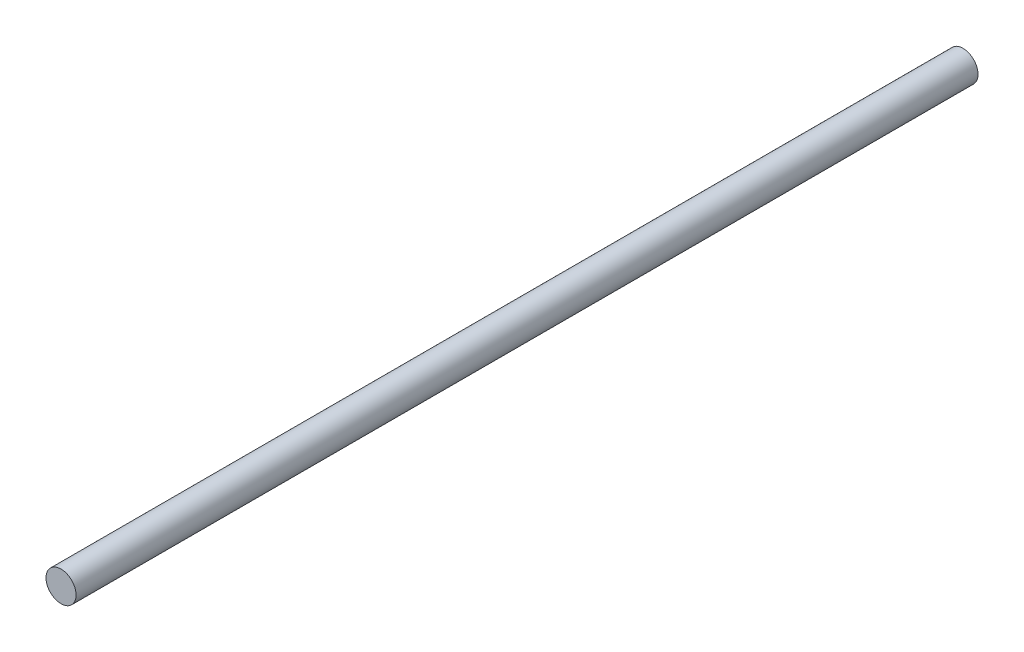
ISO-10303-21;
HEADER;
FILE_DESCRIPTION(('STEP AP214'),'2;1');
FILE_NAME('part.step','',(''),(''),'','','');
FILE_SCHEMA(('AUTOMOTIVE_DESIGN { 1 0 10303 214 1 1 1 1 }'));
ENDSEC;
DATA;
#1=APPLICATION_CONTEXT('core data for automotive mechanical design processes');
#2=APPLICATION_PROTOCOL_DEFINITION('international standard','automotive_design',2000,#1);
#3=PRODUCT_CONTEXT('',#1,'mechanical');
#4=PRODUCT('Part','Part','',(#3));
#5=PRODUCT_RELATED_PRODUCT_CATEGORY('part','',(#4));
#6=PRODUCT_DEFINITION_FORMATION('','',#4);
#7=PRODUCT_DEFINITION_CONTEXT('part definition',#1,'design');
#8=PRODUCT_DEFINITION('design','',#6,#7);
#9=PRODUCT_DEFINITION_SHAPE('','',#8);
#10=(LENGTH_UNIT() NAMED_UNIT(*) SI_UNIT(.MILLI.,.METRE.));
#11=(NAMED_UNIT(*) PLANE_ANGLE_UNIT() SI_UNIT($,.RADIAN.));
#12=(NAMED_UNIT(*) SI_UNIT($,.STERADIAN.) SOLID_ANGLE_UNIT());
#13=UNCERTAINTY_MEASURE_WITH_UNIT(LENGTH_MEASURE(1.E-05),#10,'distance_accuracy_value','');
#14=(GEOMETRIC_REPRESENTATION_CONTEXT(3) GLOBAL_UNCERTAINTY_ASSIGNED_CONTEXT((#13)) GLOBAL_UNIT_ASSIGNED_CONTEXT((#10,
#11,#12)) REPRESENTATION_CONTEXT('',''));
#15=CARTESIAN_POINT('',(0.,0.,0.));
#16=DIRECTION('',(0.,0.,1.));
#17=DIRECTION('',(1.,0.,0.));
#18=AXIS2_PLACEMENT_3D('',#15,#16,#17);
#19=CARTESIAN_POINT('',(0.,0.,45.));
#20=DIRECTION('',(0.,0.,-1.));
#21=DIRECTION('',(-1.,0.,0.));
#22=AXIS2_PLACEMENT_3D('',#19,#20,#21);
#23=CYLINDRICAL_SURFACE('',#22,1.);
#24=CARTESIAN_POINT('',(0.,0.,0.));
#25=DIRECTION('',(0.,0.,1.));
#26=DIRECTION('',(1.,0.,0.));
#27=AXIS2_PLACEMENT_3D('',#24,#25,#26);
#28=CIRCLE('',#27,1.);
#29=CARTESIAN_POINT('',(-1.,0.,0.));
#30=VERTEX_POINT('',#29);
#31=EDGE_CURVE('E10',#30,#30,#28,.T.);
#32=CARTESIAN_POINT('',(0.,0.,60.));
#33=DIRECTION('',(0.,0.,1.));
#34=DIRECTION('',(1.,0.,0.));
#35=AXIS2_PLACEMENT_3D('',#32,#33,#34);
#36=CIRCLE('',#35,1.);
#37=CARTESIAN_POINT('',(-1.,0.,60.));
#38=VERTEX_POINT('',#37);
#39=EDGE_CURVE('E39',#38,#38,#36,.T.);
#40=CARTESIAN_POINT('',(-1.,0.,0.));
#41=CARTESIAN_POINT('',(-1.,0.,0.624999999999994));
#42=CARTESIAN_POINT('',(-1.,0.,1.24999999999999));
#43=CARTESIAN_POINT('',(-1.,0.,2.5));
#44=CARTESIAN_POINT('',(-1.,0.,3.125));
#45=CARTESIAN_POINT('',(-1.,0.,4.375));
#46=CARTESIAN_POINT('',(-1.,0.,5.));
#47=CARTESIAN_POINT('',(-1.,0.,6.25));
#48=CARTESIAN_POINT('',(-1.,0.,6.87499999999999));
#49=CARTESIAN_POINT('',(-1.,0.,8.12499999999999));
#50=CARTESIAN_POINT('',(-1.,0.,8.74999999999999));
#51=CARTESIAN_POINT('',(-1.,0.,9.99999999999999));
#52=CARTESIAN_POINT('',(-1.,0.,10.625));
#53=CARTESIAN_POINT('',(-1.,0.,11.875));
#54=CARTESIAN_POINT('',(-1.,0.,12.5));
#55=CARTESIAN_POINT('',(-1.,0.,13.75));
#56=CARTESIAN_POINT('',(-1.,0.,14.375));
#57=CARTESIAN_POINT('',(-1.,0.,15.625));
#58=CARTESIAN_POINT('',(-1.,0.,16.25));
#59=CARTESIAN_POINT('',(-1.,0.,17.5));
#60=CARTESIAN_POINT('',(-1.,0.,18.125));
#61=CARTESIAN_POINT('',(-1.,0.,19.375));
#62=CARTESIAN_POINT('',(-1.,0.,20.));
#63=CARTESIAN_POINT('',(-1.,0.,21.25));
#64=CARTESIAN_POINT('',(-1.,0.,21.875));
#65=CARTESIAN_POINT('',(-1.,0.,23.125));
#66=CARTESIAN_POINT('',(-1.,0.,23.75));
#67=CARTESIAN_POINT('',(-1.,0.,25.));
#68=CARTESIAN_POINT('',(-1.,0.,25.625));
#69=CARTESIAN_POINT('',(-1.,0.,26.875));
#70=CARTESIAN_POINT('',(-1.,0.,27.5));
#71=CARTESIAN_POINT('',(-1.,0.,28.75));
#72=CARTESIAN_POINT('',(-1.,0.,29.375));
#73=CARTESIAN_POINT('',(-1.,0.,30.625));
#74=CARTESIAN_POINT('',(-1.,0.,31.25));
#75=CARTESIAN_POINT('',(-1.,0.,32.5));
#76=CARTESIAN_POINT('',(-1.,0.,33.125));
#77=CARTESIAN_POINT('',(-1.,0.,34.375));
#78=CARTESIAN_POINT('',(-1.,0.,35.));
#79=CARTESIAN_POINT('',(-1.,0.,36.25));
#80=CARTESIAN_POINT('',(-1.,0.,36.875));
#81=CARTESIAN_POINT('',(-1.,0.,38.125));
#82=CARTESIAN_POINT('',(-1.,0.,38.75));
#83=CARTESIAN_POINT('',(-1.,0.,40.));
#84=CARTESIAN_POINT('',(-1.,0.,40.625));
#85=CARTESIAN_POINT('',(-1.,0.,41.875));
#86=CARTESIAN_POINT('',(-1.,0.,42.5));
#87=CARTESIAN_POINT('',(-1.,0.,43.75));
#88=CARTESIAN_POINT('',(-1.,0.,44.375));
#89=CARTESIAN_POINT('',(-1.,0.,45.625));
#90=CARTESIAN_POINT('',(-1.,0.,46.25));
#91=CARTESIAN_POINT('',(-1.,0.,47.5));
#92=CARTESIAN_POINT('',(-1.,0.,48.125));
#93=CARTESIAN_POINT('',(-1.,0.,49.375));
#94=CARTESIAN_POINT('',(-1.,0.,50.));
#95=CARTESIAN_POINT('',(-1.,0.,51.25));
#96=CARTESIAN_POINT('',(-1.,0.,51.875));
#97=CARTESIAN_POINT('',(-1.,0.,53.125));
#98=CARTESIAN_POINT('',(-1.,0.,53.75));
#99=CARTESIAN_POINT('',(-1.,0.,55.));
#100=CARTESIAN_POINT('',(-1.,0.,55.625));
#101=CARTESIAN_POINT('',(-1.,0.,56.875));
#102=CARTESIAN_POINT('',(-1.,0.,57.5));
#103=CARTESIAN_POINT('',(-1.,0.,58.75));
#104=CARTESIAN_POINT('',(-1.,0.,59.375));
#105=CARTESIAN_POINT('',(-1.,0.,60.));
#106=B_SPLINE_CURVE_WITH_KNOTS('',3,(#40,#41,#42,#43,#44,#45,#46,#47,#48,#49,#50,#51,#52,#53,
#54,#55,#56,#57,#58,#59,#60,#61,#62,#63,#64,#65,#66,#67,#68,#69,#70,#71,#72,#73,#74,#75,#76,#77,
#78,#79,#80,#81,#82,#83,#84,#85,#86,#87,#88,#89,#90,#91,#92,#93,#94,#95,#96,#97,#98,#99,#100,
#101,#102,#103,#104,#105),.UNSPECIFIED.,.F.,.F.,(4,2,2,2,2,2,2,2,2,2,2,2,2,2,2,2,2,2,2,2,2,2,2,
2,2,2,2,2,2,2,2,2,4),(0.,1.875,3.75,5.62500000000001,7.5,9.375,11.25,13.125,15.,16.875,18.75,
20.625,22.5,24.375,26.25,28.125,30.,31.875,33.75,35.625,37.5,39.375,41.25,43.125,45.,46.875,
48.75,50.625,52.5,54.375,56.25,58.125,60.),.UNSPECIFIED.);
#107=EDGE_CURVE('BSEAM33',#30,#38,#106,.T.);
#108=ORIENTED_EDGE('',*,*,#31,.T.);
#109=ORIENTED_EDGE('',*,*,#39,.F.);
#110=ORIENTED_EDGE('',*,*,#107,.T.);
#111=ORIENTED_EDGE('',*,*,#107,.F.);
#112=EDGE_LOOP('',(#108,#110,#109,#111));
#113=FACE_BOUND('',#112,.T.);
#114=ADVANCED_FACE('F33',(#113),#23,.T.);
#115=CARTESIAN_POINT('',(0.,0.,0.));
#116=DIRECTION('',(0.,0.,1.));
#117=DIRECTION('',(1.,0.,0.));
#118=AXIS2_PLACEMENT_3D('',#115,#116,#117);
#119=PLANE('',#118);
#120=ORIENTED_EDGE('',*,*,#31,.F.);
#121=EDGE_LOOP('',(#120));
#122=FACE_BOUND('',#121,.T.);
#123=ADVANCED_FACE('F48',(#122),#119,.F.);
#124=CARTESIAN_POINT('',(0.,0.,60.));
#125=DIRECTION('',(0.,0.,1.));
#126=DIRECTION('',(1.,0.,0.));
#127=AXIS2_PLACEMENT_3D('',#124,#125,#126);
#128=PLANE('',#127);
#129=ORIENTED_EDGE('',*,*,#39,.T.);
#130=EDGE_LOOP('',(#129));
#131=FACE_BOUND('',#130,.T.);
#132=ADVANCED_FACE('F45',(#131),#128,.T.);
#133=CLOSED_SHELL('',(#114,#123,#132));
#134=MANIFOLD_SOLID_BREP('B2',#133);
#135=ADVANCED_BREP_SHAPE_REPRESENTATION('',(#18,#134),#14);
#136=SHAPE_DEFINITION_REPRESENTATION(#9,#135);
ENDSEC;
END-ISO-10303-21;
